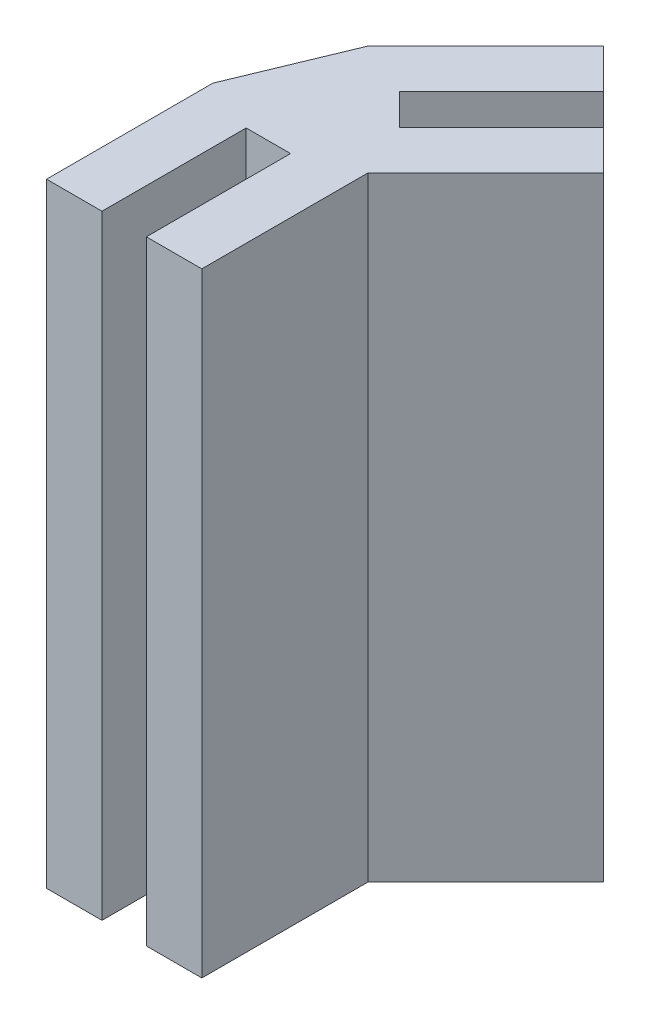
ISO-10303-21;
HEADER;
FILE_DESCRIPTION(('STEP AP214'),'2;1');
FILE_NAME('part.step','',(''),(''),'','','');
FILE_SCHEMA(('AUTOMOTIVE_DESIGN { 1 0 10303 214 1 1 1 1 }'));
ENDSEC;
DATA;
#1=APPLICATION_CONTEXT('core data for automotive mechanical design processes');
#2=APPLICATION_PROTOCOL_DEFINITION('international standard','automotive_design',2000,#1);
#3=PRODUCT_CONTEXT('',#1,'mechanical');
#4=PRODUCT('Part','Part','',(#3));
#5=PRODUCT_RELATED_PRODUCT_CATEGORY('part','',(#4));
#6=PRODUCT_DEFINITION_FORMATION('','',#4);
#7=PRODUCT_DEFINITION_CONTEXT('part definition',#1,'design');
#8=PRODUCT_DEFINITION('design','',#6,#7);
#9=PRODUCT_DEFINITION_SHAPE('','',#8);
#10=(LENGTH_UNIT() NAMED_UNIT(*) SI_UNIT(.MILLI.,.METRE.));
#11=(NAMED_UNIT(*) PLANE_ANGLE_UNIT() SI_UNIT($,.RADIAN.));
#12=(NAMED_UNIT(*) SI_UNIT($,.STERADIAN.) SOLID_ANGLE_UNIT());
#13=UNCERTAINTY_MEASURE_WITH_UNIT(LENGTH_MEASURE(1.E-05),#10,'distance_accuracy_value','');
#14=(GEOMETRIC_REPRESENTATION_CONTEXT(3) GLOBAL_UNCERTAINTY_ASSIGNED_CONTEXT((#13)) GLOBAL_UNIT_ASSIGNED_CONTEXT((#10,
#11,#12)) REPRESENTATION_CONTEXT('',''));
#15=CARTESIAN_POINT('',(0.,0.,0.));
#16=DIRECTION('',(0.,0.,1.));
#17=DIRECTION('',(1.,0.,0.));
#18=AXIS2_PLACEMENT_3D('',#15,#16,#17);
#19=CARTESIAN_POINT('',(-9.89949493661179,55.3740930822966,-9.89949493661154));
#20=DIRECTION('',(-0.923879532511289,0.,-0.382683432365084));
#21=DIRECTION('',(0.,-1.,0.));
#22=AXIS2_PLACEMENT_3D('',#19,#20,#21);
#23=PLANE('',#22);
#24=DIRECTION('',(0.,1.,0.));
#25=VECTOR('',#24,1.);
#26=CARTESIAN_POINT('',(-9.89949493661179,0.,-9.89949493661154));
#27=LINE('',#26,#25);
#28=CARTESIAN_POINT('',(-9.89949493661179,0.,-9.89949493661154));
#29=VERTEX_POINT('',#28);
#30=CARTESIAN_POINT('',(-9.89949493661179,55.3740930822966,-9.89949493661154));
#31=VERTEX_POINT('',#30);
#32=EDGE_CURVE('E255',#29,#31,#27,.T.);
#33=ORIENTED_EDGE('',*,*,#32,.F.);
#34=DIRECTION('',(0.382683432365084,0.,-0.92387953251129));
#35=VECTOR('',#34,1.);
#36=CARTESIAN_POINT('',(-11.9497474683059,0.,-4.94974746830577));
#37=LINE('',#36,#35);
#38=CARTESIAN_POINT('',(-14.,0.,0.));
#39=VERTEX_POINT('',#38);
#40=EDGE_CURVE('E47',#39,#29,#37,.T.);
#41=ORIENTED_EDGE('',*,*,#40,.F.);
#42=DIRECTION('',(0.,-1.,0.));
#43=VECTOR('',#42,1.);
#44=CARTESIAN_POINT('',(-14.,0.,0.));
#45=LINE('',#44,#43);
#46=CARTESIAN_POINT('',(-14.,55.3740930822966,0.));
#47=VERTEX_POINT('',#46);
#48=EDGE_CURVE('E258',#47,#39,#45,.T.);
#49=ORIENTED_EDGE('',*,*,#48,.F.);
#50=DIRECTION('',(-0.382683432365084,0.,0.92387953251129));
#51=VECTOR('',#50,1.);
#52=CARTESIAN_POINT('',(-9.89949493661179,55.3740930822966,-9.89949493661154));
#53=LINE('',#52,#51);
#54=EDGE_CURVE('E13',#31,#47,#53,.T.);
#55=ORIENTED_EDGE('',*,*,#54,.F.);
#56=EDGE_LOOP('',(#33,#41,#49,#55));
#57=FACE_BOUND('',#56,.T.);
#58=ADVANCED_FACE('F40',(#57),#23,.T.);
#59=CARTESIAN_POINT('',(-14.,55.3740930822966,15.));
#60=DIRECTION('',(1.,0.,0.));
#61=DIRECTION('',(0.,0.,-1.));
#62=AXIS2_PLACEMENT_3D('',#59,#60,#61);
#63=PLANE('',#62);
#64=DIRECTION('',(0.,0.,1.));
#65=VECTOR('',#64,1.);
#66=CARTESIAN_POINT('',(-14.,55.3740930822966,15.));
#67=LINE('',#66,#65);
#68=CARTESIAN_POINT('',(-14.,55.3740930822966,15.));
#69=VERTEX_POINT('',#68);
#70=EDGE_CURVE('E209',#47,#69,#67,.T.);
#71=ORIENTED_EDGE('',*,*,#70,.F.);
#72=ORIENTED_EDGE('',*,*,#48,.T.);
#73=DIRECTION('',(0.,0.,1.));
#74=VECTOR('',#73,1.);
#75=CARTESIAN_POINT('',(-14.,0.,15.));
#76=LINE('',#75,#74);
#77=CARTESIAN_POINT('',(-14.,0.,15.));
#78=VERTEX_POINT('',#77);
#79=EDGE_CURVE('E154',#39,#78,#76,.T.);
#80=ORIENTED_EDGE('',*,*,#79,.T.);
#81=DIRECTION('',(0.,-1.,0.));
#82=VECTOR('',#81,1.);
#83=CARTESIAN_POINT('',(-14.,55.3740930822966,15.));
#84=LINE('',#83,#82);
#85=EDGE_CURVE('E252',#69,#78,#84,.T.);
#86=ORIENTED_EDGE('',*,*,#85,.F.);
#87=EDGE_LOOP('',(#71,#72,#80,#86));
#88=FACE_BOUND('',#87,.T.);
#89=ADVANCED_FACE('F312',(#88),#63,.F.);
#90=CARTESIAN_POINT('',(-9.,55.3740930822966,15.));
#91=DIRECTION('',(0.,0.,-1.));
#92=DIRECTION('',(-1.,0.,0.));
#93=AXIS2_PLACEMENT_3D('',#90,#91,#92);
#94=PLANE('',#93);
#95=DIRECTION('',(1.,0.,0.));
#96=VECTOR('',#95,1.);
#97=CARTESIAN_POINT('',(-9.,0.,15.));
#98=LINE('',#97,#96);
#99=CARTESIAN_POINT('',(-9.,0.,15.));
#100=VERTEX_POINT('',#99);
#101=EDGE_CURVE('E225',#78,#100,#98,.T.);
#102=ORIENTED_EDGE('',*,*,#101,.T.);
#103=DIRECTION('',(0.,-1.,0.));
#104=VECTOR('',#103,1.);
#105=CARTESIAN_POINT('',(-9.,55.3740930822966,15.));
#106=LINE('',#105,#104);
#107=CARTESIAN_POINT('',(-9.,55.3740930822966,15.));
#108=VERTEX_POINT('',#107);
#109=EDGE_CURVE('E249',#108,#100,#106,.T.);
#110=ORIENTED_EDGE('',*,*,#109,.F.);
#111=DIRECTION('',(1.,0.,0.));
#112=VECTOR('',#111,1.);
#113=CARTESIAN_POINT('',(-9.,55.3740930822966,15.));
#114=LINE('',#113,#112);
#115=EDGE_CURVE('E211',#69,#108,#114,.T.);
#116=ORIENTED_EDGE('',*,*,#115,.F.);
#117=ORIENTED_EDGE('',*,*,#85,.T.);
#118=EDGE_LOOP('',(#102,#110,#116,#117));
#119=FACE_BOUND('',#118,.T.);
#120=ADVANCED_FACE('F308',(#119),#94,.F.);
#121=CARTESIAN_POINT('',(-9.00000000000004,55.3740930822966,1.99999999999999));
#122=DIRECTION('',(-1.,0.,0.));
#123=DIRECTION('',(0.,0.,1.));
#124=AXIS2_PLACEMENT_3D('',#121,#122,#123);
#125=PLANE('',#124);
#126=DIRECTION('',(0.,0.,-1.));
#127=VECTOR('',#126,1.);
#128=CARTESIAN_POINT('',(-9.00000000000004,0.,1.99999999999999));
#129=LINE('',#128,#127);
#130=CARTESIAN_POINT('',(-9.00000000000004,0.,1.99999999999999));
#131=VERTEX_POINT('',#130);
#132=EDGE_CURVE('E227',#100,#131,#129,.T.);
#133=ORIENTED_EDGE('',*,*,#132,.T.);
#134=DIRECTION('',(0.,-1.,0.));
#135=VECTOR('',#134,1.);
#136=CARTESIAN_POINT('',(-9.00000000000004,55.3740930822966,1.99999999999999));
#137=LINE('',#136,#135);
#138=CARTESIAN_POINT('',(-9.00000000000004,55.3740930822966,1.99999999999999));
#139=VERTEX_POINT('',#138);
#140=EDGE_CURVE('E246',#139,#131,#137,.T.);
#141=ORIENTED_EDGE('',*,*,#140,.F.);
#142=DIRECTION('',(0.,0.,-1.));
#143=VECTOR('',#142,1.);
#144=CARTESIAN_POINT('',(-9.00000000000004,55.3740930822966,1.99999999999999));
#145=LINE('',#144,#143);
#146=EDGE_CURVE('E214',#108,#139,#145,.T.);
#147=ORIENTED_EDGE('',*,*,#146,.F.);
#148=ORIENTED_EDGE('',*,*,#109,.T.);
#149=EDGE_LOOP('',(#133,#141,#147,#148));
#150=FACE_BOUND('',#149,.T.);
#151=ADVANCED_FACE('F304',(#150),#125,.F.);
#152=CARTESIAN_POINT('',(-5.00000000000004,55.3740930822966,1.99999999999999));
#153=DIRECTION('',(0.,0.,-1.));
#154=DIRECTION('',(-1.,0.,0.));
#155=AXIS2_PLACEMENT_3D('',#152,#153,#154);
#156=PLANE('',#155);
#157=DIRECTION('',(1.,0.,0.));
#158=VECTOR('',#157,1.);
#159=CARTESIAN_POINT('',(-5.00000000000004,0.,1.99999999999999));
#160=LINE('',#159,#158);
#161=CARTESIAN_POINT('',(-5.00000000000004,0.,1.99999999999999));
#162=VERTEX_POINT('',#161);
#163=EDGE_CURVE('E229',#131,#162,#160,.T.);
#164=ORIENTED_EDGE('',*,*,#163,.T.);
#165=DIRECTION('',(0.,-1.,0.));
#166=VECTOR('',#165,1.);
#167=CARTESIAN_POINT('',(-5.00000000000004,55.3740930822966,1.99999999999999));
#168=LINE('',#167,#166);
#169=CARTESIAN_POINT('',(-5.00000000000004,55.3740930822966,1.99999999999999));
#170=VERTEX_POINT('',#169);
#171=EDGE_CURVE('E243',#170,#162,#168,.T.);
#172=ORIENTED_EDGE('',*,*,#171,.F.);
#173=DIRECTION('',(1.,0.,0.));
#174=VECTOR('',#173,1.);
#175=CARTESIAN_POINT('',(-5.00000000000004,55.3740930822966,1.99999999999999));
#176=LINE('',#175,#174);
#177=EDGE_CURVE('E216',#139,#170,#176,.T.);
#178=ORIENTED_EDGE('',*,*,#177,.F.);
#179=ORIENTED_EDGE('',*,*,#140,.T.);
#180=EDGE_LOOP('',(#164,#172,#178,#179));
#181=FACE_BOUND('',#180,.T.);
#182=ADVANCED_FACE('F299',(#181),#156,.F.);
#183=CARTESIAN_POINT('',(-5.,55.3740930822966,15.));
#184=DIRECTION('',(1.,0.,0.));
#185=DIRECTION('',(0.,0.,-1.));
#186=AXIS2_PLACEMENT_3D('',#183,#184,#185);
#187=PLANE('',#186);
#188=DIRECTION('',(0.,0.,1.));
#189=VECTOR('',#188,1.);
#190=CARTESIAN_POINT('',(-5.,0.,15.));
#191=LINE('',#190,#189);
#192=CARTESIAN_POINT('',(-5.,0.,15.));
#193=VERTEX_POINT('',#192);
#194=EDGE_CURVE('E231',#162,#193,#191,.T.);
#195=ORIENTED_EDGE('',*,*,#194,.T.);
#196=DIRECTION('',(0.,-1.,0.));
#197=VECTOR('',#196,1.);
#198=CARTESIAN_POINT('',(-5.,55.3740930822966,15.));
#199=LINE('',#198,#197);
#200=CARTESIAN_POINT('',(-5.,55.3740930822966,15.));
#201=VERTEX_POINT('',#200);
#202=EDGE_CURVE('E240',#201,#193,#199,.T.);
#203=ORIENTED_EDGE('',*,*,#202,.F.);
#204=DIRECTION('',(0.,0.,1.));
#205=VECTOR('',#204,1.);
#206=CARTESIAN_POINT('',(-5.,55.3740930822966,15.));
#207=LINE('',#206,#205);
#208=EDGE_CURVE('E218',#170,#201,#207,.T.);
#209=ORIENTED_EDGE('',*,*,#208,.F.);
#210=ORIENTED_EDGE('',*,*,#171,.T.);
#211=EDGE_LOOP('',(#195,#203,#209,#210));
#212=FACE_BOUND('',#211,.T.);
#213=ADVANCED_FACE('F294',(#212),#187,.F.);
#214=CARTESIAN_POINT('',(0.,55.3740930822966,15.));
#215=DIRECTION('',(0.,0.,-1.));
#216=DIRECTION('',(-1.,0.,0.));
#217=AXIS2_PLACEMENT_3D('',#214,#215,#216);
#218=PLANE('',#217);
#219=DIRECTION('',(1.,0.,0.));
#220=VECTOR('',#219,1.);
#221=CARTESIAN_POINT('',(0.,0.,15.));
#222=LINE('',#221,#220);
#223=CARTESIAN_POINT('',(0.,0.,15.));
#224=VERTEX_POINT('',#223);
#225=EDGE_CURVE('E233',#193,#224,#222,.T.);
#226=ORIENTED_EDGE('',*,*,#225,.T.);
#227=DIRECTION('',(0.,-1.,0.));
#228=VECTOR('',#227,1.);
#229=CARTESIAN_POINT('',(0.,55.3740930822966,15.));
#230=LINE('',#229,#228);
#231=CARTESIAN_POINT('',(0.,55.3740930822966,15.));
#232=VERTEX_POINT('',#231);
#233=EDGE_CURVE('E237',#232,#224,#230,.T.);
#234=ORIENTED_EDGE('',*,*,#233,.F.);
#235=DIRECTION('',(1.,0.,0.));
#236=VECTOR('',#235,1.);
#237=CARTESIAN_POINT('',(0.,55.3740930822966,15.));
#238=LINE('',#237,#236);
#239=EDGE_CURVE('E220',#201,#232,#238,.T.);
#240=ORIENTED_EDGE('',*,*,#239,.F.);
#241=ORIENTED_EDGE('',*,*,#202,.T.);
#242=EDGE_LOOP('',(#226,#234,#240,#241));
#243=FACE_BOUND('',#242,.T.);
#244=ADVANCED_FACE('F290',(#243),#218,.F.);
#245=CARTESIAN_POINT('',(0.,55.3740930822966,0.));
#246=DIRECTION('',(-1.,0.,0.));
#247=DIRECTION('',(0.,0.,1.));
#248=AXIS2_PLACEMENT_3D('',#245,#246,#247);
#249=PLANE('',#248);
#250=DIRECTION('',(0.,0.,-1.));
#251=VECTOR('',#250,1.);
#252=CARTESIAN_POINT('',(0.,0.,0.));
#253=LINE('',#252,#251);
#254=CARTESIAN_POINT('',(0.,0.,0.));
#255=VERTEX_POINT('',#254);
#256=EDGE_CURVE('E212',#224,#255,#253,.T.);
#257=ORIENTED_EDGE('',*,*,#256,.T.);
#258=DIRECTION('',(0.,-1.,0.));
#259=VECTOR('',#258,1.);
#260=CARTESIAN_POINT('',(0.,55.3740930822966,0.));
#261=LINE('',#260,#259);
#262=CARTESIAN_POINT('',(0.,55.3740930822966,0.));
#263=VERTEX_POINT('',#262);
#264=EDGE_CURVE('E223',#263,#255,#261,.T.);
#265=ORIENTED_EDGE('',*,*,#264,.F.);
#266=DIRECTION('',(0.,0.,-1.));
#267=VECTOR('',#266,1.);
#268=CARTESIAN_POINT('',(0.,55.3740930822966,0.));
#269=LINE('',#268,#267);
#270=EDGE_CURVE('E163',#232,#263,#269,.T.);
#271=ORIENTED_EDGE('',*,*,#270,.F.);
#272=ORIENTED_EDGE('',*,*,#233,.T.);
#273=EDGE_LOOP('',(#257,#265,#271,#272));
#274=FACE_BOUND('',#273,.T.);
#275=ADVANCED_FACE('F286',(#274),#249,.F.);
#276=CARTESIAN_POINT('',(0.,55.3740930822966,0.));
#277=DIRECTION('',(0.,-1.,0.));
#278=DIRECTION('',(0.,0.,-1.));
#279=AXIS2_PLACEMENT_3D('',#276,#277,#278);
#280=PLANE('',#279);
#281=DIRECTION('',(0.707106781186539,0.,-0.707106781186557));
#282=VECTOR('',#281,1.);
#283=CARTESIAN_POINT('',(0.707106781186283,55.3740930822966,-20.5060966544099));
#284=LINE('',#283,#282);
#285=CARTESIAN_POINT('',(0.707106781186283,55.3740930822966,-20.5060966544099));
#286=VERTEX_POINT('',#285);
#287=EDGE_CURVE('E181',#31,#286,#284,.T.);
#288=ORIENTED_EDGE('',*,*,#287,.F.);
#289=ORIENTED_EDGE('',*,*,#54,.T.);
#290=ORIENTED_EDGE('',*,*,#70,.T.);
#291=ORIENTED_EDGE('',*,*,#115,.T.);
#292=ORIENTED_EDGE('',*,*,#146,.T.);
#293=ORIENTED_EDGE('',*,*,#177,.T.);
#294=ORIENTED_EDGE('',*,*,#208,.T.);
#295=ORIENTED_EDGE('',*,*,#239,.T.);
#296=ORIENTED_EDGE('',*,*,#270,.T.);
#297=DIRECTION('',(-0.707106781186539,0.,0.707106781186556));
#298=VECTOR('',#297,1.);
#299=CARTESIAN_POINT('',(0.,55.3740930822966,0.));
#300=LINE('',#299,#298);
#301=CARTESIAN_POINT('',(10.6066017177981,55.3740930822966,-10.6066017177983));
#302=VERTEX_POINT('',#301);
#303=EDGE_CURVE('E147',#302,#263,#300,.T.);
#304=ORIENTED_EDGE('',*,*,#303,.F.);
#305=DIRECTION('',(0.707106781186556,0.,0.707106781186539));
#306=VECTOR('',#305,1.);
#307=CARTESIAN_POINT('',(10.6066017177981,55.3740930822966,-10.6066017177983));
#308=LINE('',#307,#306);
#309=CARTESIAN_POINT('',(7.07106781186529,55.3740930822966,-14.142135623731));
#310=VERTEX_POINT('',#309);
#311=EDGE_CURVE('E160',#310,#302,#308,.T.);
#312=ORIENTED_EDGE('',*,*,#311,.F.);
#313=DIRECTION('',(0.707106781186541,0.,-0.707106781186554));
#314=VECTOR('',#313,1.);
#315=CARTESIAN_POINT('',(7.07106781186529,55.3740930822966,-14.142135623731));
#316=LINE('',#315,#314);
#317=CARTESIAN_POINT('',(-2.12132034355974,55.3740930822966,-4.94974746830583));
#318=VERTEX_POINT('',#317);
#319=EDGE_CURVE('E168',#318,#310,#316,.T.);
#320=ORIENTED_EDGE('',*,*,#319,.F.);
#321=DIRECTION('',(0.707106781186556,0.,0.707106781186539));
#322=VECTOR('',#321,1.);
#323=CARTESIAN_POINT('',(-2.12132034355974,55.3740930822966,-4.94974746830583));
#324=LINE('',#323,#322);
#325=CARTESIAN_POINT('',(-4.94974746830597,55.3740930822966,-7.77817459305198));
#326=VERTEX_POINT('',#325);
#327=EDGE_CURVE('E170',#326,#318,#324,.T.);
#328=ORIENTED_EDGE('',*,*,#327,.F.);
#329=DIRECTION('',(-0.707106781186541,0.,0.707106781186554));
#330=VECTOR('',#329,1.);
#331=CARTESIAN_POINT('',(-4.94974746830597,55.3740930822966,-7.77817459305198));
#332=LINE('',#331,#330);
#333=CARTESIAN_POINT('',(4.24264068711906,55.3740930822966,-16.9705627484772));
#334=VERTEX_POINT('',#333);
#335=EDGE_CURVE('E175',#334,#326,#332,.T.);
#336=ORIENTED_EDGE('',*,*,#335,.F.);
#337=DIRECTION('',(0.707106781186556,0.,0.707106781186539));
#338=VECTOR('',#337,1.);
#339=CARTESIAN_POINT('',(4.24264068711906,55.3740930822966,-16.9705627484772));
#340=LINE('',#339,#338);
#341=EDGE_CURVE('E178',#286,#334,#340,.T.);
#342=ORIENTED_EDGE('',*,*,#341,.F.);
#343=EDGE_LOOP('',(#288,#289,#290,#291,#292,#293,#294,#295,#296,#304,#312,#320,#328,#336,#342));
#344=FACE_BOUND('',#343,.T.);
#345=ADVANCED_FACE('F158',(#344),#280,.F.);
#346=CARTESIAN_POINT('',(0.,0.,0.));
#347=DIRECTION('',(0.,-1.,0.));
#348=DIRECTION('',(0.,0.,-1.));
#349=AXIS2_PLACEMENT_3D('',#346,#347,#348);
#350=PLANE('',#349);
#351=ORIENTED_EDGE('',*,*,#79,.F.);
#352=ORIENTED_EDGE('',*,*,#40,.T.);
#353=DIRECTION('',(0.707106781186539,0.,-0.707106781186557));
#354=VECTOR('',#353,1.);
#355=CARTESIAN_POINT('',(0.707106781186283,0.,-20.5060966544099));
#356=LINE('',#355,#354);
#357=CARTESIAN_POINT('',(0.707106781186283,0.,-20.5060966544099));
#358=VERTEX_POINT('',#357);
#359=EDGE_CURVE('E165',#29,#358,#356,.T.);
#360=ORIENTED_EDGE('',*,*,#359,.T.);
#361=DIRECTION('',(0.707106781186556,0.,0.707106781186539));
#362=VECTOR('',#361,1.);
#363=CARTESIAN_POINT('',(4.24264068711906,0.,-16.9705627484772));
#364=LINE('',#363,#362);
#365=CARTESIAN_POINT('',(4.24264068711906,0.,-16.9705627484772));
#366=VERTEX_POINT('',#365);
#367=EDGE_CURVE('E196',#358,#366,#364,.T.);
#368=ORIENTED_EDGE('',*,*,#367,.T.);
#369=DIRECTION('',(-0.707106781186541,0.,0.707106781186554));
#370=VECTOR('',#369,1.);
#371=CARTESIAN_POINT('',(-4.94974746830597,0.,-7.77817459305198));
#372=LINE('',#371,#370);
#373=CARTESIAN_POINT('',(-4.94974746830597,0.,-7.77817459305198));
#374=VERTEX_POINT('',#373);
#375=EDGE_CURVE('E193',#366,#374,#372,.T.);
#376=ORIENTED_EDGE('',*,*,#375,.T.);
#377=DIRECTION('',(0.707106781186556,0.,0.707106781186539));
#378=VECTOR('',#377,1.);
#379=CARTESIAN_POINT('',(-2.12132034355974,0.,-4.94974746830583));
#380=LINE('',#379,#378);
#381=CARTESIAN_POINT('',(-2.12132034355974,0.,-4.94974746830583));
#382=VERTEX_POINT('',#381);
#383=EDGE_CURVE('E190',#374,#382,#380,.T.);
#384=ORIENTED_EDGE('',*,*,#383,.T.);
#385=DIRECTION('',(0.707106781186541,0.,-0.707106781186554));
#386=VECTOR('',#385,1.);
#387=CARTESIAN_POINT('',(7.07106781186529,0.,-14.142135623731));
#388=LINE('',#387,#386);
#389=CARTESIAN_POINT('',(7.07106781186529,0.,-14.142135623731));
#390=VERTEX_POINT('',#389);
#391=EDGE_CURVE('E187',#382,#390,#388,.T.);
#392=ORIENTED_EDGE('',*,*,#391,.T.);
#393=DIRECTION('',(0.707106781186556,0.,0.707106781186539));
#394=VECTOR('',#393,1.);
#395=CARTESIAN_POINT('',(10.6066017177981,0.,-10.6066017177983));
#396=LINE('',#395,#394);
#397=CARTESIAN_POINT('',(10.6066017177981,0.,-10.6066017177983));
#398=VERTEX_POINT('',#397);
#399=EDGE_CURVE('E185',#390,#398,#396,.T.);
#400=ORIENTED_EDGE('',*,*,#399,.T.);
#401=DIRECTION('',(-0.707106781186539,0.,0.707106781186556));
#402=VECTOR('',#401,1.);
#403=CARTESIAN_POINT('',(0.,0.,0.));
#404=LINE('',#403,#402);
#405=EDGE_CURVE('E149',#398,#255,#404,.T.);
#406=ORIENTED_EDGE('',*,*,#405,.T.);
#407=ORIENTED_EDGE('',*,*,#256,.F.);
#408=ORIENTED_EDGE('',*,*,#225,.F.);
#409=ORIENTED_EDGE('',*,*,#194,.F.);
#410=ORIENTED_EDGE('',*,*,#163,.F.);
#411=ORIENTED_EDGE('',*,*,#132,.F.);
#412=ORIENTED_EDGE('',*,*,#101,.F.);
#413=EDGE_LOOP('',(#351,#352,#360,#368,#376,#384,#392,#400,#406,#407,#408,#409,#410,#411,#412));
#414=FACE_BOUND('',#413,.T.);
#415=ADVANCED_FACE('F261',(#414),#350,.T.);
#416=CARTESIAN_POINT('',(0.,55.3740930822966,0.));
#417=DIRECTION('',(0.707106781186556,0.,0.707106781186539));
#418=DIRECTION('',(0.707106781186539,0.,-0.707106781186556));
#419=AXIS2_PLACEMENT_3D('',#416,#417,#418);
#420=PLANE('',#419);
#421=ORIENTED_EDGE('',*,*,#405,.F.);
#422=DIRECTION('',(0.,-1.,0.));
#423=VECTOR('',#422,1.);
#424=CARTESIAN_POINT('',(10.6066017177981,55.3740930822966,-10.6066017177983));
#425=LINE('',#424,#423);
#426=EDGE_CURVE('E143',#302,#398,#425,.T.);
#427=ORIENTED_EDGE('',*,*,#426,.F.);
#428=ORIENTED_EDGE('',*,*,#303,.T.);
#429=ORIENTED_EDGE('',*,*,#264,.T.);
#430=EDGE_LOOP('',(#421,#427,#428,#429));
#431=FACE_BOUND('',#430,.T.);
#432=ADVANCED_FACE('F145',(#431),#420,.T.);
#433=CARTESIAN_POINT('',(10.6066017177981,55.3740930822966,-10.6066017177983));
#434=DIRECTION('',(0.707106781186539,0.,-0.707106781186556));
#435=DIRECTION('',(-0.707106781186556,0.,-0.707106781186539));
#436=AXIS2_PLACEMENT_3D('',#433,#434,#435);
#437=PLANE('',#436);
#438=ORIENTED_EDGE('',*,*,#399,.F.);
#439=DIRECTION('',(0.,-1.,0.));
#440=VECTOR('',#439,1.);
#441=CARTESIAN_POINT('',(7.07106781186529,55.3740930822966,-14.142135623731));
#442=LINE('',#441,#440);
#443=EDGE_CURVE('E155',#310,#390,#442,.T.);
#444=ORIENTED_EDGE('',*,*,#443,.F.);
#445=ORIENTED_EDGE('',*,*,#311,.T.);
#446=ORIENTED_EDGE('',*,*,#426,.T.);
#447=EDGE_LOOP('',(#438,#444,#445,#446));
#448=FACE_BOUND('',#447,.T.);
#449=ADVANCED_FACE('F167',(#448),#437,.T.);
#450=CARTESIAN_POINT('',(7.07106781186529,55.3740930822966,-14.142135623731));
#451=DIRECTION('',(-0.707106781186554,0.,-0.707106781186541));
#452=DIRECTION('',(-0.707106781186541,0.,0.707106781186554));
#453=AXIS2_PLACEMENT_3D('',#450,#451,#452);
#454=PLANE('',#453);
#455=ORIENTED_EDGE('',*,*,#391,.F.);
#456=DIRECTION('',(0.,-1.,0.));
#457=VECTOR('',#456,1.);
#458=CARTESIAN_POINT('',(-2.12132034355974,55.3740930822966,-4.94974746830583));
#459=LINE('',#458,#457);
#460=EDGE_CURVE('E206',#318,#382,#459,.T.);
#461=ORIENTED_EDGE('',*,*,#460,.F.);
#462=ORIENTED_EDGE('',*,*,#319,.T.);
#463=ORIENTED_EDGE('',*,*,#443,.T.);
#464=EDGE_LOOP('',(#455,#461,#462,#463));
#465=FACE_BOUND('',#464,.T.);
#466=ADVANCED_FACE('F281',(#465),#454,.T.);
#467=CARTESIAN_POINT('',(-2.12132034355974,55.3740930822966,-4.94974746830583));
#468=DIRECTION('',(0.707106781186539,0.,-0.707106781186556));
#469=DIRECTION('',(-0.707106781186556,0.,-0.707106781186539));
#470=AXIS2_PLACEMENT_3D('',#467,#468,#469);
#471=PLANE('',#470);
#472=ORIENTED_EDGE('',*,*,#383,.F.);
#473=DIRECTION('',(0.,-1.,0.));
#474=VECTOR('',#473,1.);
#475=CARTESIAN_POINT('',(-4.94974746830597,55.3740930822966,-7.77817459305198));
#476=LINE('',#475,#474);
#477=EDGE_CURVE('E204',#326,#374,#476,.T.);
#478=ORIENTED_EDGE('',*,*,#477,.F.);
#479=ORIENTED_EDGE('',*,*,#327,.T.);
#480=ORIENTED_EDGE('',*,*,#460,.T.);
#481=EDGE_LOOP('',(#472,#478,#479,#480));
#482=FACE_BOUND('',#481,.T.);
#483=ADVANCED_FACE('F278',(#482),#471,.T.);
#484=CARTESIAN_POINT('',(-4.94974746830597,55.3740930822966,-7.77817459305198));
#485=DIRECTION('',(0.707106781186554,0.,0.707106781186541));
#486=DIRECTION('',(0.707106781186541,0.,-0.707106781186554));
#487=AXIS2_PLACEMENT_3D('',#484,#485,#486);
#488=PLANE('',#487);
#489=ORIENTED_EDGE('',*,*,#375,.F.);
#490=DIRECTION('',(0.,-1.,0.));
#491=VECTOR('',#490,1.);
#492=CARTESIAN_POINT('',(4.24264068711906,55.3740930822966,-16.9705627484772));
#493=LINE('',#492,#491);
#494=EDGE_CURVE('E202',#334,#366,#493,.T.);
#495=ORIENTED_EDGE('',*,*,#494,.F.);
#496=ORIENTED_EDGE('',*,*,#335,.T.);
#497=ORIENTED_EDGE('',*,*,#477,.T.);
#498=EDGE_LOOP('',(#489,#495,#496,#497));
#499=FACE_BOUND('',#498,.T.);
#500=ADVANCED_FACE('F274',(#499),#488,.T.);
#501=CARTESIAN_POINT('',(4.24264068711906,55.3740930822966,-16.9705627484772));
#502=DIRECTION('',(0.707106781186539,0.,-0.707106781186556));
#503=DIRECTION('',(-0.707106781186556,0.,-0.707106781186539));
#504=AXIS2_PLACEMENT_3D('',#501,#502,#503);
#505=PLANE('',#504);
#506=ORIENTED_EDGE('',*,*,#367,.F.);
#507=DIRECTION('',(0.,-1.,0.));
#508=VECTOR('',#507,1.);
#509=CARTESIAN_POINT('',(0.707106781186283,55.3740930822966,-20.5060966544099));
#510=LINE('',#509,#508);
#511=EDGE_CURVE('E183',#286,#358,#510,.T.);
#512=ORIENTED_EDGE('',*,*,#511,.F.);
#513=ORIENTED_EDGE('',*,*,#341,.T.);
#514=ORIENTED_EDGE('',*,*,#494,.T.);
#515=EDGE_LOOP('',(#506,#512,#513,#514));
#516=FACE_BOUND('',#515,.T.);
#517=ADVANCED_FACE('F270',(#516),#505,.T.);
#518=CARTESIAN_POINT('',(0.707106781186283,55.3740930822966,-20.5060966544099));
#519=DIRECTION('',(-0.707106781186556,0.,-0.707106781186539));
#520=DIRECTION('',(-0.707106781186539,0.,0.707106781186556));
#521=AXIS2_PLACEMENT_3D('',#518,#519,#520);
#522=PLANE('',#521);
#523=ORIENTED_EDGE('',*,*,#359,.F.);
#524=ORIENTED_EDGE('',*,*,#32,.T.);
#525=ORIENTED_EDGE('',*,*,#287,.T.);
#526=ORIENTED_EDGE('',*,*,#511,.T.);
#527=EDGE_LOOP('',(#523,#524,#525,#526));
#528=FACE_BOUND('',#527,.T.);
#529=ADVANCED_FACE('F265',(#528),#522,.T.);
#530=CLOSED_SHELL('',(#58,#89,#120,#151,#182,#213,#244,#275,#345,#415,#432,#449,#466,#483,#500,
#517,#529));
#531=MANIFOLD_SOLID_BREP('B2',#530);
#532=ADVANCED_BREP_SHAPE_REPRESENTATION('',(#18,#531),#14);
#533=SHAPE_DEFINITION_REPRESENTATION(#9,#532);
ENDSEC;
END-ISO-10303-21;
